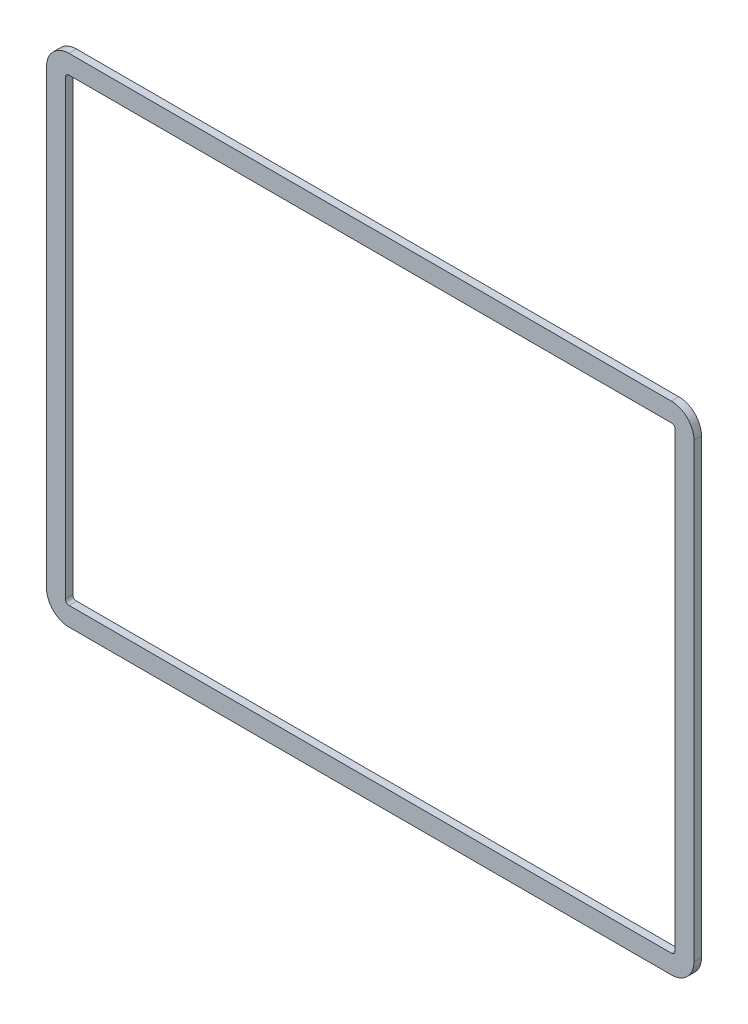
ISO-10303-21;
HEADER;
FILE_DESCRIPTION(('STEP AP214'),'2;1');
FILE_NAME('part.step','',(''),(''),'','','');
FILE_SCHEMA(('AUTOMOTIVE_DESIGN { 1 0 10303 214 1 1 1 1 }'));
ENDSEC;
DATA;
#1=APPLICATION_CONTEXT('core data for automotive mechanical design processes');
#2=APPLICATION_PROTOCOL_DEFINITION('international standard','automotive_design',2000,#1);
#3=PRODUCT_CONTEXT('',#1,'mechanical');
#4=PRODUCT('Part','Part','',(#3));
#5=PRODUCT_RELATED_PRODUCT_CATEGORY('part','',(#4));
#6=PRODUCT_DEFINITION_FORMATION('','',#4);
#7=PRODUCT_DEFINITION_CONTEXT('part definition',#1,'design');
#8=PRODUCT_DEFINITION('design','',#6,#7);
#9=PRODUCT_DEFINITION_SHAPE('','',#8);
#10=(LENGTH_UNIT() NAMED_UNIT(*) SI_UNIT(.MILLI.,.METRE.));
#11=(NAMED_UNIT(*) PLANE_ANGLE_UNIT() SI_UNIT($,.RADIAN.));
#12=(NAMED_UNIT(*) SI_UNIT($,.STERADIAN.) SOLID_ANGLE_UNIT());
#13=UNCERTAINTY_MEASURE_WITH_UNIT(LENGTH_MEASURE(1.E-05),#10,'distance_accuracy_value','');
#14=(GEOMETRIC_REPRESENTATION_CONTEXT(3) GLOBAL_UNCERTAINTY_ASSIGNED_CONTEXT((#13)) GLOBAL_UNIT_ASSIGNED_CONTEXT((#10,
#11,#12)) REPRESENTATION_CONTEXT('',''));
#15=CARTESIAN_POINT('',(0.,0.,0.));
#16=DIRECTION('',(0.,0.,1.));
#17=DIRECTION('',(1.,0.,0.));
#18=AXIS2_PLACEMENT_3D('',#15,#16,#17);
#19=CARTESIAN_POINT('',(842.873702112464,-1472.46252894504,-2.54));
#20=DIRECTION('',(0.,0.,1.));
#21=DIRECTION('',(1.,0.,0.));
#22=AXIS2_PLACEMENT_3D('',#19,#20,#21);
#23=PLANE('',#22);
#24=DIRECTION('',(1.,0.,0.));
#25=VECTOR('',#24,1.);
#26=CARTESIAN_POINT('',(639.673702112464,-1473.73252894504,-2.54));
#27=LINE('',#26,#25);
#28=CARTESIAN_POINT('',(639.673702112464,-1473.73252894504,-2.54));
#29=VERTEX_POINT('',#28);
#30=CARTESIAN_POINT('',(842.873702112464,-1473.73252894504,-2.54));
#31=VERTEX_POINT('',#30);
#32=EDGE_CURVE('E185',#29,#31,#27,.T.);
#33=ORIENTED_EDGE('',*,*,#32,.T.);
#34=CARTESIAN_POINT('',(842.873702112464,-1472.46252894504,-2.54));
#35=DIRECTION('',(0.,0.,1.));
#36=DIRECTION('',(1.,0.,0.));
#37=AXIS2_PLACEMENT_3D('',#34,#35,#36);
#38=CIRCLE('',#37,1.26999999999999);
#39=CARTESIAN_POINT('',(844.143702112464,-1472.46252894504,-2.54));
#40=VERTEX_POINT('',#39);
#41=EDGE_CURVE('E275',#31,#40,#38,.T.);
#42=ORIENTED_EDGE('',*,*,#41,.T.);
#43=DIRECTION('',(0.,1.,0.));
#44=VECTOR('',#43,1.);
#45=CARTESIAN_POINT('',(844.143702112464,-1472.46252894504,-2.54));
#46=LINE('',#45,#44);
#47=CARTESIAN_POINT('',(844.143702112464,-1320.06252894504,-2.54));
#48=VERTEX_POINT('',#47);
#49=EDGE_CURVE('E288',#40,#48,#46,.T.);
#50=ORIENTED_EDGE('',*,*,#49,.T.);
#51=CARTESIAN_POINT('',(842.873702112464,-1320.06252894504,-2.54));
#52=DIRECTION('',(0.,0.,1.));
#53=DIRECTION('',(1.,0.,0.));
#54=AXIS2_PLACEMENT_3D('',#51,#52,#53);
#55=CIRCLE('',#54,1.27000000000005);
#56=CARTESIAN_POINT('',(842.873702112464,-1318.79252894504,-2.54));
#57=VERTEX_POINT('',#56);
#58=EDGE_CURVE('E286',#48,#57,#55,.T.);
#59=ORIENTED_EDGE('',*,*,#58,.T.);
#60=DIRECTION('',(-1.,0.,0.));
#61=VECTOR('',#60,1.);
#62=CARTESIAN_POINT('',(842.873702112464,-1318.79252894504,-2.54));
#63=LINE('',#62,#61);
#64=CARTESIAN_POINT('',(639.673702112464,-1318.79252894504,-2.54));
#65=VERTEX_POINT('',#64);
#66=EDGE_CURVE('E173',#57,#65,#63,.T.);
#67=ORIENTED_EDGE('',*,*,#66,.T.);
#68=CARTESIAN_POINT('',(639.673702112464,-1320.06252894504,-2.54));
#69=DIRECTION('',(0.,0.,1.));
#70=DIRECTION('',(1.,0.,0.));
#71=AXIS2_PLACEMENT_3D('',#68,#69,#70);
#72=CIRCLE('',#71,1.26999999999988);
#73=CARTESIAN_POINT('',(638.403702112464,-1320.06252894504,-2.54));
#74=VERTEX_POINT('',#73);
#75=EDGE_CURVE('E283',#65,#74,#72,.T.);
#76=ORIENTED_EDGE('',*,*,#75,.T.);
#77=DIRECTION('',(0.,-1.,0.));
#78=VECTOR('',#77,1.);
#79=CARTESIAN_POINT('',(638.403702112464,-1320.06252894504,-2.54));
#80=LINE('',#79,#78);
#81=CARTESIAN_POINT('',(638.403702112464,-1472.46252894504,-2.54));
#82=VERTEX_POINT('',#81);
#83=EDGE_CURVE('E265',#74,#82,#80,.T.);
#84=ORIENTED_EDGE('',*,*,#83,.T.);
#85=CARTESIAN_POINT('',(639.673702112464,-1472.46252894504,-2.54));
#86=DIRECTION('',(0.,0.,1.));
#87=DIRECTION('',(1.,0.,0.));
#88=AXIS2_PLACEMENT_3D('',#85,#86,#87);
#89=CIRCLE('',#88,1.27000000000005);
#90=EDGE_CURVE('E279',#82,#29,#89,.T.);
#91=ORIENTED_EDGE('',*,*,#90,.T.);
#92=EDGE_LOOP('',(#33,#42,#50,#59,#67,#76,#84,#91));
#93=FACE_BOUND('',#92,.T.);
#94=CARTESIAN_POINT('',(842.873702112464,-1472.46252894504,-2.54));
#95=DIRECTION('',(0.,0.,1.));
#96=DIRECTION('',(1.,0.,0.));
#97=AXIS2_PLACEMENT_3D('',#94,#95,#96);
#98=CIRCLE('',#97,7.62000000000002);
#99=CARTESIAN_POINT('',(842.873702112464,-1480.08252894504,-2.54));
#100=VERTEX_POINT('',#99);
#101=CARTESIAN_POINT('',(850.493702112464,-1472.46252894504,-2.54));
#102=VERTEX_POINT('',#101);
#103=EDGE_CURVE('E186',#100,#102,#98,.T.);
#104=ORIENTED_EDGE('',*,*,#103,.F.);
#105=DIRECTION('',(1.,0.,0.));
#106=VECTOR('',#105,1.);
#107=CARTESIAN_POINT('',(639.673702112464,-1480.08252894504,-2.54));
#108=LINE('',#107,#106);
#109=CARTESIAN_POINT('',(639.673702112464,-1480.08252894504,-2.54));
#110=VERTEX_POINT('',#109);
#111=EDGE_CURVE('E208',#110,#100,#108,.T.);
#112=ORIENTED_EDGE('',*,*,#111,.F.);
#113=CARTESIAN_POINT('',(639.673702112464,-1472.46252894504,-2.54));
#114=DIRECTION('',(0.,0.,1.));
#115=DIRECTION('',(1.,0.,0.));
#116=AXIS2_PLACEMENT_3D('',#113,#114,#115);
#117=CIRCLE('',#116,7.62000000000002);
#118=CARTESIAN_POINT('',(632.053702112464,-1472.46252894504,-2.54));
#119=VERTEX_POINT('',#118);
#120=EDGE_CURVE('E205',#119,#110,#117,.T.);
#121=ORIENTED_EDGE('',*,*,#120,.F.);
#122=DIRECTION('',(0.,-1.,0.));
#123=VECTOR('',#122,1.);
#124=CARTESIAN_POINT('',(632.053702112464,-1320.06252894504,-2.54));
#125=LINE('',#124,#123);
#126=CARTESIAN_POINT('',(632.053702112464,-1320.06252894504,-2.54));
#127=VERTEX_POINT('',#126);
#128=EDGE_CURVE('E202',#127,#119,#125,.T.);
#129=ORIENTED_EDGE('',*,*,#128,.F.);
#130=CARTESIAN_POINT('',(639.673702112464,-1320.06252894504,-2.54));
#131=DIRECTION('',(0.,0.,1.));
#132=DIRECTION('',(1.,0.,0.));
#133=AXIS2_PLACEMENT_3D('',#130,#131,#132);
#134=CIRCLE('',#133,7.62000000000002);
#135=CARTESIAN_POINT('',(639.673702112464,-1312.44252894504,-2.54));
#136=VERTEX_POINT('',#135);
#137=EDGE_CURVE('E199',#136,#127,#134,.T.);
#138=ORIENTED_EDGE('',*,*,#137,.F.);
#139=DIRECTION('',(-1.,0.,0.));
#140=VECTOR('',#139,1.);
#141=CARTESIAN_POINT('',(842.873702112464,-1312.44252894504,-2.54));
#142=LINE('',#141,#140);
#143=CARTESIAN_POINT('',(842.873702112464,-1312.44252894504,-2.54));
#144=VERTEX_POINT('',#143);
#145=EDGE_CURVE('E196',#144,#136,#142,.T.);
#146=ORIENTED_EDGE('',*,*,#145,.F.);
#147=CARTESIAN_POINT('',(842.873702112464,-1320.06252894504,-2.54));
#148=DIRECTION('',(0.,0.,1.));
#149=DIRECTION('',(1.,0.,0.));
#150=AXIS2_PLACEMENT_3D('',#147,#148,#149);
#151=CIRCLE('',#150,7.62000000000002);
#152=CARTESIAN_POINT('',(850.493702112464,-1320.06252894504,-2.54));
#153=VERTEX_POINT('',#152);
#154=EDGE_CURVE('E193',#153,#144,#151,.T.);
#155=ORIENTED_EDGE('',*,*,#154,.F.);
#156=DIRECTION('',(0.,1.,0.));
#157=VECTOR('',#156,1.);
#158=CARTESIAN_POINT('',(850.493702112464,-1472.46252894504,-2.54));
#159=LINE('',#158,#157);
#160=EDGE_CURVE('E189',#102,#153,#159,.T.);
#161=ORIENTED_EDGE('',*,*,#160,.F.);
#162=EDGE_LOOP('',(#104,#112,#121,#129,#138,#146,#155,#161));
#163=FACE_BOUND('',#162,.T.);
#164=ADVANCED_FACE('F38',(#93,#163),#23,.F.);
#165=CARTESIAN_POINT('',(842.873702112464,-1312.44252894504,-2.54));
#166=DIRECTION('',(0.,1.,0.));
#167=DIRECTION('',(0.,0.,1.));
#168=AXIS2_PLACEMENT_3D('',#165,#166,#167);
#169=PLANE('',#168);
#170=DIRECTION('',(-1.,0.,0.));
#171=VECTOR('',#170,1.);
#172=CARTESIAN_POINT('',(842.873702112464,-1312.44252894504,0.));
#173=LINE('',#172,#171);
#174=CARTESIAN_POINT('',(842.873702112464,-1312.44252894504,0.));
#175=VERTEX_POINT('',#174);
#176=CARTESIAN_POINT('',(639.673702112464,-1312.44252894504,0.));
#177=VERTEX_POINT('',#176);
#178=EDGE_CURVE('E216',#175,#177,#173,.T.);
#179=ORIENTED_EDGE('',*,*,#178,.F.);
#180=DIRECTION('',(0.,0.,1.));
#181=VECTOR('',#180,1.);
#182=CARTESIAN_POINT('',(842.873702112464,-1312.44252894504,-2.54));
#183=LINE('',#182,#181);
#184=EDGE_CURVE('E244',#144,#175,#183,.T.);
#185=ORIENTED_EDGE('',*,*,#184,.F.);
#186=ORIENTED_EDGE('',*,*,#145,.T.);
#187=DIRECTION('',(0.,0.,1.));
#188=VECTOR('',#187,1.);
#189=CARTESIAN_POINT('',(639.673702112464,-1312.44252894504,-2.54));
#190=LINE('',#189,#188);
#191=EDGE_CURVE('E241',#136,#177,#190,.T.);
#192=ORIENTED_EDGE('',*,*,#191,.T.);
#193=EDGE_LOOP('',(#179,#185,#186,#192));
#194=FACE_BOUND('',#193,.T.);
#195=ADVANCED_FACE('F319',(#194),#169,.T.);
#196=CARTESIAN_POINT('',(842.873702112464,-1320.06252894504,-2.54));
#197=DIRECTION('',(0.,0.,1.));
#198=DIRECTION('',(1.,0.,0.));
#199=AXIS2_PLACEMENT_3D('',#196,#197,#198);
#200=CYLINDRICAL_SURFACE('',#199,7.62000000000002);
#201=CARTESIAN_POINT('',(842.873702112464,-1320.06252894504,0.));
#202=DIRECTION('',(0.,0.,1.));
#203=DIRECTION('',(1.,0.,0.));
#204=AXIS2_PLACEMENT_3D('',#201,#202,#203);
#205=CIRCLE('',#204,7.62000000000002);
#206=CARTESIAN_POINT('',(850.493702112464,-1320.06252894504,0.));
#207=VERTEX_POINT('',#206);
#208=EDGE_CURVE('E213',#207,#175,#205,.T.);
#209=ORIENTED_EDGE('',*,*,#208,.F.);
#210=DIRECTION('',(0.,0.,1.));
#211=VECTOR('',#210,1.);
#212=CARTESIAN_POINT('',(850.493702112464,-1320.06252894504,-2.54));
#213=LINE('',#212,#211);
#214=EDGE_CURVE('E247',#153,#207,#213,.T.);
#215=ORIENTED_EDGE('',*,*,#214,.F.);
#216=ORIENTED_EDGE('',*,*,#154,.T.);
#217=ORIENTED_EDGE('',*,*,#184,.T.);
#218=EDGE_LOOP('',(#209,#215,#216,#217));
#219=FACE_BOUND('',#218,.T.);
#220=ADVANCED_FACE('F321',(#219),#200,.T.);
#221=CARTESIAN_POINT('',(842.873702112464,-1472.46252894504,-2.54));
#222=DIRECTION('',(0.,0.,1.));
#223=DIRECTION('',(1.,0.,0.));
#224=AXIS2_PLACEMENT_3D('',#221,#222,#223);
#225=CYLINDRICAL_SURFACE('',#224,7.62000000000002);
#226=CARTESIAN_POINT('',(842.873702112464,-1472.46252894504,0.));
#227=DIRECTION('',(0.,0.,1.));
#228=DIRECTION('',(1.,0.,0.));
#229=AXIS2_PLACEMENT_3D('',#226,#227,#228);
#230=CIRCLE('',#229,7.62000000000002);
#231=CARTESIAN_POINT('',(842.873702112464,-1480.08252894504,0.));
#232=VERTEX_POINT('',#231);
#233=CARTESIAN_POINT('',(850.493702112464,-1472.46252894504,0.));
#234=VERTEX_POINT('',#233);
#235=EDGE_CURVE('E11',#232,#234,#230,.T.);
#236=ORIENTED_EDGE('',*,*,#235,.F.);
#237=DIRECTION('',(0.,0.,1.));
#238=VECTOR('',#237,1.);
#239=CARTESIAN_POINT('',(842.873702112464,-1480.08252894504,-2.54));
#240=LINE('',#239,#238);
#241=EDGE_CURVE('E162',#100,#232,#240,.T.);
#242=ORIENTED_EDGE('',*,*,#241,.F.);
#243=ORIENTED_EDGE('',*,*,#103,.T.);
#244=DIRECTION('',(0.,0.,1.));
#245=VECTOR('',#244,1.);
#246=CARTESIAN_POINT('',(850.493702112464,-1472.46252894504,-2.54));
#247=LINE('',#246,#245);
#248=EDGE_CURVE('E210',#102,#234,#247,.T.);
#249=ORIENTED_EDGE('',*,*,#248,.T.);
#250=EDGE_LOOP('',(#236,#242,#243,#249));
#251=FACE_BOUND('',#250,.T.);
#252=ADVANCED_FACE('F328',(#251),#225,.T.);
#253=CARTESIAN_POINT('',(842.873702112464,-1320.06252894504,-2.54));
#254=DIRECTION('',(0.,0.,1.));
#255=DIRECTION('',(1.,0.,0.));
#256=AXIS2_PLACEMENT_3D('',#253,#254,#255);
#257=CYLINDRICAL_SURFACE('',#256,1.27000000000005);
#258=DIRECTION('',(0.,0.,1.));
#259=VECTOR('',#258,1.);
#260=CARTESIAN_POINT('',(844.143702112464,-1320.06252894504,-2.54));
#261=LINE('',#260,#259);
#262=CARTESIAN_POINT('',(844.143702112464,-1320.06252894504,0.));
#263=VERTEX_POINT('',#262);
#264=EDGE_CURVE('E158',#48,#263,#261,.T.);
#265=ORIENTED_EDGE('',*,*,#264,.T.);
#266=CARTESIAN_POINT('',(842.873702112464,-1320.06252894504,0.));
#267=DIRECTION('',(0.,0.,-1.));
#268=DIRECTION('',(-1.,0.,0.));
#269=AXIS2_PLACEMENT_3D('',#266,#267,#268);
#270=CIRCLE('',#269,1.27000000000005);
#271=CARTESIAN_POINT('',(842.873702112464,-1318.79252894504,0.));
#272=VERTEX_POINT('',#271);
#273=EDGE_CURVE('E42',#263,#272,#270,.F.);
#274=ORIENTED_EDGE('',*,*,#273,.T.);
#275=DIRECTION('',(0.,0.,1.));
#276=VECTOR('',#275,1.);
#277=CARTESIAN_POINT('',(842.873702112464,-1318.79252894504,-2.54));
#278=LINE('',#277,#276);
#279=EDGE_CURVE('E155',#57,#272,#278,.T.);
#280=ORIENTED_EDGE('',*,*,#279,.F.);
#281=ORIENTED_EDGE('',*,*,#58,.F.);
#282=EDGE_LOOP('',(#265,#274,#280,#281));
#283=FACE_BOUND('',#282,.T.);
#284=ADVANCED_FACE('F152',(#283),#257,.F.);
#285=CARTESIAN_POINT('',(639.673702112464,-1320.06252894504,-2.54));
#286=DIRECTION('',(0.,0.,1.));
#287=DIRECTION('',(1.,0.,0.));
#288=AXIS2_PLACEMENT_3D('',#285,#286,#287);
#289=CYLINDRICAL_SURFACE('',#288,1.26999999999988);
#290=DIRECTION('',(0.,0.,1.));
#291=VECTOR('',#290,1.);
#292=CARTESIAN_POINT('',(639.673702112464,-1318.79252894504,-2.54));
#293=LINE('',#292,#291);
#294=CARTESIAN_POINT('',(639.673702112464,-1318.79252894504,0.));
#295=VERTEX_POINT('',#294);
#296=EDGE_CURVE('E175',#65,#295,#293,.T.);
#297=ORIENTED_EDGE('',*,*,#296,.T.);
#298=CARTESIAN_POINT('',(639.673702112464,-1320.06252894504,0.));
#299=DIRECTION('',(0.,0.,-1.));
#300=DIRECTION('',(-1.,0.,0.));
#301=AXIS2_PLACEMENT_3D('',#298,#299,#300);
#302=CIRCLE('',#301,1.26999999999988);
#303=CARTESIAN_POINT('',(638.403702112464,-1320.06252894504,0.));
#304=VERTEX_POINT('',#303);
#305=EDGE_CURVE('E161',#295,#304,#302,.F.);
#306=ORIENTED_EDGE('',*,*,#305,.T.);
#307=DIRECTION('',(0.,0.,1.));
#308=VECTOR('',#307,1.);
#309=CARTESIAN_POINT('',(638.403702112464,-1320.06252894504,-2.54));
#310=LINE('',#309,#308);
#311=EDGE_CURVE('E177',#74,#304,#310,.T.);
#312=ORIENTED_EDGE('',*,*,#311,.F.);
#313=ORIENTED_EDGE('',*,*,#75,.F.);
#314=EDGE_LOOP('',(#297,#306,#312,#313));
#315=FACE_BOUND('',#314,.T.);
#316=ADVANCED_FACE('F253',(#315),#289,.F.);
#317=CARTESIAN_POINT('',(639.673702112464,-1320.06252894504,-2.54));
#318=DIRECTION('',(0.,0.,1.));
#319=DIRECTION('',(1.,0.,0.));
#320=AXIS2_PLACEMENT_3D('',#317,#318,#319);
#321=CYLINDRICAL_SURFACE('',#320,7.62000000000002);
#322=CARTESIAN_POINT('',(639.673702112464,-1320.06252894504,0.));
#323=DIRECTION('',(0.,0.,1.));
#324=DIRECTION('',(1.,0.,0.));
#325=AXIS2_PLACEMENT_3D('',#322,#323,#324);
#326=CIRCLE('',#325,7.62000000000002);
#327=CARTESIAN_POINT('',(632.053702112464,-1320.06252894504,0.));
#328=VERTEX_POINT('',#327);
#329=EDGE_CURVE('E219',#177,#328,#326,.T.);
#330=ORIENTED_EDGE('',*,*,#329,.F.);
#331=ORIENTED_EDGE('',*,*,#191,.F.);
#332=ORIENTED_EDGE('',*,*,#137,.T.);
#333=DIRECTION('',(0.,0.,1.));
#334=VECTOR('',#333,1.);
#335=CARTESIAN_POINT('',(632.053702112464,-1320.06252894504,-2.54));
#336=LINE('',#335,#334);
#337=EDGE_CURVE('E238',#127,#328,#336,.T.);
#338=ORIENTED_EDGE('',*,*,#337,.T.);
#339=EDGE_LOOP('',(#330,#331,#332,#338));
#340=FACE_BOUND('',#339,.T.);
#341=ADVANCED_FACE('F334',(#340),#321,.T.);
#342=CARTESIAN_POINT('',(639.673702112464,-1480.08252894504,-2.54));
#343=DIRECTION('',(0.,-1.,0.));
#344=DIRECTION('',(0.,0.,-1.));
#345=AXIS2_PLACEMENT_3D('',#342,#343,#344);
#346=PLANE('',#345);
#347=DIRECTION('',(1.,0.,0.));
#348=VECTOR('',#347,1.);
#349=CARTESIAN_POINT('',(639.673702112464,-1480.08252894504,0.));
#350=LINE('',#349,#348);
#351=CARTESIAN_POINT('',(639.673702112464,-1480.08252894504,0.));
#352=VERTEX_POINT('',#351);
#353=EDGE_CURVE('E227',#352,#232,#350,.T.);
#354=ORIENTED_EDGE('',*,*,#353,.F.);
#355=DIRECTION('',(0.,0.,1.));
#356=VECTOR('',#355,1.);
#357=CARTESIAN_POINT('',(639.673702112464,-1480.08252894504,-2.54));
#358=LINE('',#357,#356);
#359=EDGE_CURVE('E232',#110,#352,#358,.T.);
#360=ORIENTED_EDGE('',*,*,#359,.F.);
#361=ORIENTED_EDGE('',*,*,#111,.T.);
#362=ORIENTED_EDGE('',*,*,#241,.T.);
#363=EDGE_LOOP('',(#354,#360,#361,#362));
#364=FACE_BOUND('',#363,.T.);
#365=ADVANCED_FACE('F351',(#364),#346,.T.);
#366=CARTESIAN_POINT('',(632.053702112464,-1320.06252894504,-2.54));
#367=DIRECTION('',(-1.,0.,0.));
#368=DIRECTION('',(0.,0.,1.));
#369=AXIS2_PLACEMENT_3D('',#366,#367,#368);
#370=PLANE('',#369);
#371=DIRECTION('',(0.,-1.,0.));
#372=VECTOR('',#371,1.);
#373=CARTESIAN_POINT('',(632.053702112464,-1320.06252894504,0.));
#374=LINE('',#373,#372);
#375=CARTESIAN_POINT('',(632.053702112464,-1472.46252894504,0.));
#376=VERTEX_POINT('',#375);
#377=EDGE_CURVE('E222',#328,#376,#374,.T.);
#378=ORIENTED_EDGE('',*,*,#377,.F.);
#379=ORIENTED_EDGE('',*,*,#337,.F.);
#380=ORIENTED_EDGE('',*,*,#128,.T.);
#381=DIRECTION('',(0.,0.,1.));
#382=VECTOR('',#381,1.);
#383=CARTESIAN_POINT('',(632.053702112464,-1472.46252894504,-2.54));
#384=LINE('',#383,#382);
#385=EDGE_CURVE('E235',#119,#376,#384,.T.);
#386=ORIENTED_EDGE('',*,*,#385,.T.);
#387=EDGE_LOOP('',(#378,#379,#380,#386));
#388=FACE_BOUND('',#387,.T.);
#389=ADVANCED_FACE('F353',(#388),#370,.T.);
#390=CARTESIAN_POINT('',(0.,0.,0.));
#391=DIRECTION('',(0.,0.,-1.));
#392=DIRECTION('',(-1.,0.,0.));
#393=AXIS2_PLACEMENT_3D('',#390,#391,#392);
#394=PLANE('',#393);
#395=ORIENTED_EDGE('',*,*,#353,.T.);
#396=ORIENTED_EDGE('',*,*,#235,.T.);
#397=DIRECTION('',(0.,1.,0.));
#398=VECTOR('',#397,1.);
#399=CARTESIAN_POINT('',(850.493702112464,-1472.46252894504,0.));
#400=LINE('',#399,#398);
#401=EDGE_CURVE('E47',#234,#207,#400,.T.);
#402=ORIENTED_EDGE('',*,*,#401,.T.);
#403=ORIENTED_EDGE('',*,*,#208,.T.);
#404=ORIENTED_EDGE('',*,*,#178,.T.);
#405=ORIENTED_EDGE('',*,*,#329,.T.);
#406=ORIENTED_EDGE('',*,*,#377,.T.);
#407=CARTESIAN_POINT('',(639.673702112464,-1472.46252894504,0.));
#408=DIRECTION('',(0.,0.,1.));
#409=DIRECTION('',(1.,0.,0.));
#410=AXIS2_PLACEMENT_3D('',#407,#408,#409);
#411=CIRCLE('',#410,7.62000000000002);
#412=EDGE_CURVE('E225',#376,#352,#411,.T.);
#413=ORIENTED_EDGE('',*,*,#412,.T.);
#414=EDGE_LOOP('',(#395,#396,#402,#403,#404,#405,#406,#413));
#415=FACE_BOUND('',#414,.T.);
#416=ORIENTED_EDGE('',*,*,#273,.F.);
#417=DIRECTION('',(0.,1.,0.));
#418=VECTOR('',#417,1.);
#419=CARTESIAN_POINT('',(844.143702112464,-1472.46252894504,0.));
#420=LINE('',#419,#418);
#421=CARTESIAN_POINT('',(844.143702112464,-1472.46252894504,0.));
#422=VERTEX_POINT('',#421);
#423=EDGE_CURVE('E170',#422,#263,#420,.T.);
#424=ORIENTED_EDGE('',*,*,#423,.F.);
#425=CARTESIAN_POINT('',(842.873702112464,-1472.46252894504,0.));
#426=DIRECTION('',(0.,0.,-1.));
#427=DIRECTION('',(-1.,0.,0.));
#428=AXIS2_PLACEMENT_3D('',#425,#426,#427);
#429=CIRCLE('',#428,1.26999999999999);
#430=CARTESIAN_POINT('',(842.873702112464,-1473.73252894504,0.));
#431=VERTEX_POINT('',#430);
#432=EDGE_CURVE('E229',#431,#422,#429,.F.);
#433=ORIENTED_EDGE('',*,*,#432,.F.);
#434=DIRECTION('',(1.,0.,0.));
#435=VECTOR('',#434,1.);
#436=CARTESIAN_POINT('',(639.673702112464,-1473.73252894504,0.));
#437=LINE('',#436,#435);
#438=CARTESIAN_POINT('',(639.673702112464,-1473.73252894504,0.));
#439=VERTEX_POINT('',#438);
#440=EDGE_CURVE('E262',#439,#431,#437,.T.);
#441=ORIENTED_EDGE('',*,*,#440,.F.);
#442=CARTESIAN_POINT('',(639.673702112464,-1472.46252894504,0.));
#443=DIRECTION('',(0.,0.,-1.));
#444=DIRECTION('',(-1.,0.,0.));
#445=AXIS2_PLACEMENT_3D('',#442,#443,#444);
#446=CIRCLE('',#445,1.27000000000005);
#447=CARTESIAN_POINT('',(638.403702112464,-1472.46252894504,0.));
#448=VERTEX_POINT('',#447);
#449=EDGE_CURVE('E251',#448,#439,#446,.F.);
#450=ORIENTED_EDGE('',*,*,#449,.F.);
#451=DIRECTION('',(0.,-1.,0.));
#452=VECTOR('',#451,1.);
#453=CARTESIAN_POINT('',(638.403702112464,-1320.06252894504,0.));
#454=LINE('',#453,#452);
#455=EDGE_CURVE('E169',#304,#448,#454,.T.);
#456=ORIENTED_EDGE('',*,*,#455,.F.);
#457=ORIENTED_EDGE('',*,*,#305,.F.);
#458=DIRECTION('',(-1.,0.,0.));
#459=VECTOR('',#458,1.);
#460=CARTESIAN_POINT('',(842.873702112464,-1318.79252894504,0.));
#461=LINE('',#460,#459);
#462=EDGE_CURVE('E164',#272,#295,#461,.T.);
#463=ORIENTED_EDGE('',*,*,#462,.F.);
#464=EDGE_LOOP('',(#416,#424,#433,#441,#450,#456,#457,#463));
#465=FACE_BOUND('',#464,.T.);
#466=ADVANCED_FACE('F40',(#415,#465),#394,.F.);
#467=CARTESIAN_POINT('',(639.673702112464,-1472.46252894504,-2.54));
#468=DIRECTION('',(0.,0.,1.));
#469=DIRECTION('',(1.,0.,0.));
#470=AXIS2_PLACEMENT_3D('',#467,#468,#469);
#471=CYLINDRICAL_SURFACE('',#470,7.62000000000002);
#472=ORIENTED_EDGE('',*,*,#412,.F.);
#473=ORIENTED_EDGE('',*,*,#385,.F.);
#474=ORIENTED_EDGE('',*,*,#120,.T.);
#475=ORIENTED_EDGE('',*,*,#359,.T.);
#476=EDGE_LOOP('',(#472,#473,#474,#475));
#477=FACE_BOUND('',#476,.T.);
#478=ADVANCED_FACE('F308',(#477),#471,.T.);
#479=CARTESIAN_POINT('',(639.673702112464,-1472.46252894504,-2.54));
#480=DIRECTION('',(0.,0.,1.));
#481=DIRECTION('',(1.,0.,0.));
#482=AXIS2_PLACEMENT_3D('',#479,#480,#481);
#483=CYLINDRICAL_SURFACE('',#482,1.27000000000005);
#484=DIRECTION('',(0.,0.,1.));
#485=VECTOR('',#484,1.);
#486=CARTESIAN_POINT('',(638.403702112464,-1472.46252894504,-2.54));
#487=LINE('',#486,#485);
#488=EDGE_CURVE('E267',#82,#448,#487,.T.);
#489=ORIENTED_EDGE('',*,*,#488,.T.);
#490=ORIENTED_EDGE('',*,*,#449,.T.);
#491=DIRECTION('',(0.,0.,1.));
#492=VECTOR('',#491,1.);
#493=CARTESIAN_POINT('',(639.673702112464,-1473.73252894504,-2.54));
#494=LINE('',#493,#492);
#495=EDGE_CURVE('E268',#29,#439,#494,.T.);
#496=ORIENTED_EDGE('',*,*,#495,.F.);
#497=ORIENTED_EDGE('',*,*,#90,.F.);
#498=EDGE_LOOP('',(#489,#490,#496,#497));
#499=FACE_BOUND('',#498,.T.);
#500=ADVANCED_FACE('F306',(#499),#483,.F.);
#501=CARTESIAN_POINT('',(842.873702112464,-1472.46252894504,-2.54));
#502=DIRECTION('',(0.,0.,1.));
#503=DIRECTION('',(1.,0.,0.));
#504=AXIS2_PLACEMENT_3D('',#501,#502,#503);
#505=CYLINDRICAL_SURFACE('',#504,1.26999999999999);
#506=DIRECTION('',(0.,0.,1.));
#507=VECTOR('',#506,1.);
#508=CARTESIAN_POINT('',(842.873702112464,-1473.73252894504,-2.54));
#509=LINE('',#508,#507);
#510=EDGE_CURVE('E190',#31,#431,#509,.T.);
#511=ORIENTED_EDGE('',*,*,#510,.T.);
#512=ORIENTED_EDGE('',*,*,#432,.T.);
#513=DIRECTION('',(0.,0.,1.));
#514=VECTOR('',#513,1.);
#515=CARTESIAN_POINT('',(844.143702112464,-1472.46252894504,-2.54));
#516=LINE('',#515,#514);
#517=EDGE_CURVE('E179',#40,#422,#516,.T.);
#518=ORIENTED_EDGE('',*,*,#517,.F.);
#519=ORIENTED_EDGE('',*,*,#41,.F.);
#520=EDGE_LOOP('',(#511,#512,#518,#519));
#521=FACE_BOUND('',#520,.T.);
#522=ADVANCED_FACE('F298',(#521),#505,.F.);
#523=CARTESIAN_POINT('',(639.673702112464,-1473.73252894504,-2.54));
#524=DIRECTION('',(0.,-1.,0.));
#525=DIRECTION('',(0.,0.,-1.));
#526=AXIS2_PLACEMENT_3D('',#523,#524,#525);
#527=PLANE('',#526);
#528=ORIENTED_EDGE('',*,*,#510,.F.);
#529=ORIENTED_EDGE('',*,*,#32,.F.);
#530=ORIENTED_EDGE('',*,*,#495,.T.);
#531=ORIENTED_EDGE('',*,*,#440,.T.);
#532=EDGE_LOOP('',(#528,#529,#530,#531));
#533=FACE_BOUND('',#532,.T.);
#534=ADVANCED_FACE('F303',(#533),#527,.F.);
#535=CARTESIAN_POINT('',(638.403702112464,-1320.06252894504,-2.54));
#536=DIRECTION('',(-1.,0.,0.));
#537=DIRECTION('',(0.,-1.,0.));
#538=AXIS2_PLACEMENT_3D('',#535,#536,#537);
#539=PLANE('',#538);
#540=ORIENTED_EDGE('',*,*,#488,.F.);
#541=ORIENTED_EDGE('',*,*,#83,.F.);
#542=ORIENTED_EDGE('',*,*,#311,.T.);
#543=ORIENTED_EDGE('',*,*,#455,.T.);
#544=EDGE_LOOP('',(#540,#541,#542,#543));
#545=FACE_BOUND('',#544,.T.);
#546=ADVANCED_FACE('F264',(#545),#539,.F.);
#547=CARTESIAN_POINT('',(842.873702112464,-1318.79252894504,-2.54));
#548=DIRECTION('',(0.,1.,0.));
#549=DIRECTION('',(-1.,0.,0.));
#550=AXIS2_PLACEMENT_3D('',#547,#548,#549);
#551=PLANE('',#550);
#552=ORIENTED_EDGE('',*,*,#296,.F.);
#553=ORIENTED_EDGE('',*,*,#66,.F.);
#554=ORIENTED_EDGE('',*,*,#279,.T.);
#555=ORIENTED_EDGE('',*,*,#462,.T.);
#556=EDGE_LOOP('',(#552,#553,#554,#555));
#557=FACE_BOUND('',#556,.T.);
#558=ADVANCED_FACE('F172',(#557),#551,.F.);
#559=CARTESIAN_POINT('',(844.143702112464,-1472.46252894504,-2.54));
#560=DIRECTION('',(1.,0.,0.));
#561=DIRECTION('',(0.,1.,0.));
#562=AXIS2_PLACEMENT_3D('',#559,#560,#561);
#563=PLANE('',#562);
#564=ORIENTED_EDGE('',*,*,#264,.F.);
#565=ORIENTED_EDGE('',*,*,#49,.F.);
#566=ORIENTED_EDGE('',*,*,#517,.T.);
#567=ORIENTED_EDGE('',*,*,#423,.T.);
#568=EDGE_LOOP('',(#564,#565,#566,#567));
#569=FACE_BOUND('',#568,.T.);
#570=ADVANCED_FACE('F301',(#569),#563,.F.);
#571=CARTESIAN_POINT('',(850.493702112464,-1472.46252894504,-2.54));
#572=DIRECTION('',(1.,0.,0.));
#573=DIRECTION('',(0.,0.,-1.));
#574=AXIS2_PLACEMENT_3D('',#571,#572,#573);
#575=PLANE('',#574);
#576=ORIENTED_EDGE('',*,*,#401,.F.);
#577=ORIENTED_EDGE('',*,*,#248,.F.);
#578=ORIENTED_EDGE('',*,*,#160,.T.);
#579=ORIENTED_EDGE('',*,*,#214,.T.);
#580=EDGE_LOOP('',(#576,#577,#578,#579));
#581=FACE_BOUND('',#580,.T.);
#582=ADVANCED_FACE('F332',(#581),#575,.T.);
#583=CLOSED_SHELL('',(#164,#195,#220,#252,#284,#316,#341,#365,#389,#466,#478,#500,#522,#534,
#546,#558,#570,#582));
#584=MANIFOLD_SOLID_BREP('B2',#583);
#585=ADVANCED_BREP_SHAPE_REPRESENTATION('',(#18,#584),#14);
#586=SHAPE_DEFINITION_REPRESENTATION(#9,#585);
ENDSEC;
END-ISO-10303-21;
